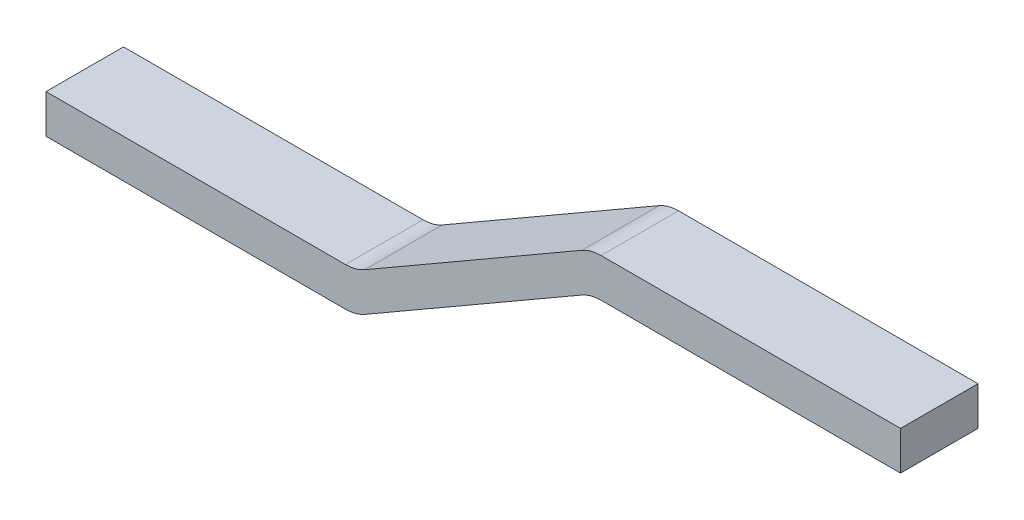
ISO-10303-21;
HEADER;
FILE_DESCRIPTION(('STEP AP214'),'2;1');
FILE_NAME('part.step','',(''),(''),'','','');
FILE_SCHEMA(('AUTOMOTIVE_DESIGN { 1 0 10303 214 1 1 1 1 }'));
ENDSEC;
DATA;
#1=APPLICATION_CONTEXT('core data for automotive mechanical design processes');
#2=APPLICATION_PROTOCOL_DEFINITION('international standard','automotive_design',2000,#1);
#3=PRODUCT_CONTEXT('',#1,'mechanical');
#4=PRODUCT('Part','Part','',(#3));
#5=PRODUCT_RELATED_PRODUCT_CATEGORY('part','',(#4));
#6=PRODUCT_DEFINITION_FORMATION('','',#4);
#7=PRODUCT_DEFINITION_CONTEXT('part definition',#1,'design');
#8=PRODUCT_DEFINITION('design','',#6,#7);
#9=PRODUCT_DEFINITION_SHAPE('','',#8);
#10=(LENGTH_UNIT() NAMED_UNIT(*) SI_UNIT(.MILLI.,.METRE.));
#11=(NAMED_UNIT(*) PLANE_ANGLE_UNIT() SI_UNIT($,.RADIAN.));
#12=(NAMED_UNIT(*) SI_UNIT($,.STERADIAN.) SOLID_ANGLE_UNIT());
#13=UNCERTAINTY_MEASURE_WITH_UNIT(LENGTH_MEASURE(1.E-05),#10,'distance_accuracy_value','');
#14=(GEOMETRIC_REPRESENTATION_CONTEXT(3) GLOBAL_UNCERTAINTY_ASSIGNED_CONTEXT((#13)) GLOBAL_UNIT_ASSIGNED_CONTEXT((#10,
#11,#12)) REPRESENTATION_CONTEXT('',''));
#15=CARTESIAN_POINT('',(0.,0.,0.));
#16=DIRECTION('',(0.,0.,1.));
#17=DIRECTION('',(1.,0.,0.));
#18=AXIS2_PLACEMENT_3D('',#15,#16,#17);
#19=CARTESIAN_POINT('',(20.,0.,10.));
#20=DIRECTION('',(0.,-1.,0.));
#21=DIRECTION('',(1.,0.,0.));
#22=AXIS2_PLACEMENT_3D('',#19,#20,#21);
#23=PLANE('',#22);
#24=DIRECTION('',(-1.,0.,0.));
#25=VECTOR('',#24,1.);
#26=CARTESIAN_POINT('',(20.,0.,0.));
#27=LINE('',#26,#25);
#28=CARTESIAN_POINT('',(18.6602540378444,0.,0.));
#29=VERTEX_POINT('',#28);
#30=CARTESIAN_POINT('',(-20.,0.,0.));
#31=VERTEX_POINT('',#30);
#32=EDGE_CURVE('E157',#29,#31,#27,.T.);
#33=ORIENTED_EDGE('',*,*,#32,.F.);
#34=DIRECTION('',(0.,0.,-1.));
#35=VECTOR('',#34,1.);
#36=CARTESIAN_POINT('',(18.6602540378444,0.,10.));
#37=LINE('',#36,#35);
#38=CARTESIAN_POINT('',(18.6602540378444,0.,10.));
#39=VERTEX_POINT('',#38);
#40=EDGE_CURVE('E54',#29,#39,#37,.F.);
#41=ORIENTED_EDGE('',*,*,#40,.T.);
#42=DIRECTION('',(-1.,0.,0.));
#43=VECTOR('',#42,1.);
#44=CARTESIAN_POINT('',(20.,0.,10.));
#45=LINE('',#44,#43);
#46=CARTESIAN_POINT('',(-20.,0.,10.));
#47=VERTEX_POINT('',#46);
#48=EDGE_CURVE('E121',#39,#47,#45,.T.);
#49=ORIENTED_EDGE('',*,*,#48,.T.);
#50=DIRECTION('',(0.,0.,-1.));
#51=VECTOR('',#50,1.);
#52=CARTESIAN_POINT('',(-20.,0.,10.));
#53=LINE('',#52,#51);
#54=EDGE_CURVE('E123',#47,#31,#53,.T.);
#55=ORIENTED_EDGE('',*,*,#54,.T.);
#56=EDGE_LOOP('',(#33,#41,#49,#55));
#57=FACE_BOUND('',#56,.T.);
#58=ADVANCED_FACE('F33',(#57),#23,.T.);
#59=CARTESIAN_POINT('',(50.3108891324553,17.5,10.));
#60=DIRECTION('',(0.500000000000001,-0.866025403784438,0.));
#61=DIRECTION('',(0.866025403784438,0.500000000000001,0.));
#62=AXIS2_PLACEMENT_3D('',#59,#60,#61);
#63=PLANE('',#62);
#64=DIRECTION('',(-0.866025403784438,-0.500000000000001,0.));
#65=VECTOR('',#64,1.);
#66=CARTESIAN_POINT('',(50.3108891324553,17.5,0.));
#67=LINE('',#66,#65);
#68=CARTESIAN_POINT('',(49.1506350946109,16.8301270189222,0.));
#69=VERTEX_POINT('',#68);
#70=CARTESIAN_POINT('',(21.1602540378444,0.669872981077815,0.));
#71=VERTEX_POINT('',#70);
#72=EDGE_CURVE('E128',#69,#71,#67,.T.);
#73=ORIENTED_EDGE('',*,*,#72,.F.);
#74=DIRECTION('',(0.,0.,-1.));
#75=VECTOR('',#74,1.);
#76=CARTESIAN_POINT('',(49.1506350946109,16.8301270189222,10.));
#77=LINE('',#76,#75);
#78=CARTESIAN_POINT('',(49.1506350946109,16.8301270189222,10.));
#79=VERTEX_POINT('',#78);
#80=EDGE_CURVE('E188',#69,#79,#77,.F.);
#81=ORIENTED_EDGE('',*,*,#80,.T.);
#82=DIRECTION('',(-0.866025403784438,-0.500000000000001,0.));
#83=VECTOR('',#82,1.);
#84=CARTESIAN_POINT('',(50.3108891324553,17.5,10.));
#85=LINE('',#84,#83);
#86=CARTESIAN_POINT('',(21.1602540378444,0.669872981077815,10.));
#87=VERTEX_POINT('',#86);
#88=EDGE_CURVE('E136',#79,#87,#85,.T.);
#89=ORIENTED_EDGE('',*,*,#88,.T.);
#90=DIRECTION('',(0.,0.,-1.));
#91=VECTOR('',#90,1.);
#92=CARTESIAN_POINT('',(21.1602540378444,0.669872981077815,10.));
#93=LINE('',#92,#91);
#94=EDGE_CURVE('E185',#87,#71,#93,.T.);
#95=ORIENTED_EDGE('',*,*,#94,.T.);
#96=EDGE_LOOP('',(#73,#81,#89,#95));
#97=FACE_BOUND('',#96,.T.);
#98=ADVANCED_FACE('F231',(#97),#63,.T.);
#99=CARTESIAN_POINT('',(90.3108891324553,17.5,10.));
#100=DIRECTION('',(0.,-1.,0.));
#101=DIRECTION('',(1.,0.,0.));
#102=AXIS2_PLACEMENT_3D('',#99,#100,#101);
#103=PLANE('',#102);
#104=DIRECTION('',(-1.,0.,0.));
#105=VECTOR('',#104,1.);
#106=CARTESIAN_POINT('',(90.3108891324553,17.5,10.));
#107=LINE('',#106,#105);
#108=CARTESIAN_POINT('',(90.3108891324553,17.5,10.));
#109=VERTEX_POINT('',#108);
#110=CARTESIAN_POINT('',(51.6506350946109,17.5,10.));
#111=VERTEX_POINT('',#110);
#112=EDGE_CURVE('E152',#109,#111,#107,.T.);
#113=ORIENTED_EDGE('',*,*,#112,.T.);
#114=DIRECTION('',(0.,0.,-1.));
#115=VECTOR('',#114,1.);
#116=CARTESIAN_POINT('',(51.6506350946109,17.5,0.));
#117=LINE('',#116,#115);
#118=CARTESIAN_POINT('',(51.6506350946109,17.5,0.));
#119=VERTEX_POINT('',#118);
#120=EDGE_CURVE('E178',#111,#119,#117,.T.);
#121=ORIENTED_EDGE('',*,*,#120,.T.);
#122=DIRECTION('',(-1.,0.,0.));
#123=VECTOR('',#122,1.);
#124=CARTESIAN_POINT('',(90.3108891324553,17.5,0.));
#125=LINE('',#124,#123);
#126=CARTESIAN_POINT('',(90.3108891324553,17.5,0.));
#127=VERTEX_POINT('',#126);
#128=EDGE_CURVE('E171',#127,#119,#125,.T.);
#129=ORIENTED_EDGE('',*,*,#128,.F.);
#130=DIRECTION('',(0.,0.,-1.));
#131=VECTOR('',#130,1.);
#132=CARTESIAN_POINT('',(90.3108891324553,17.5,10.));
#133=LINE('',#132,#131);
#134=EDGE_CURVE('E176',#109,#127,#133,.T.);
#135=ORIENTED_EDGE('',*,*,#134,.F.);
#136=EDGE_LOOP('',(#113,#121,#129,#135));
#137=FACE_BOUND('',#136,.T.);
#138=ADVANCED_FACE('F239',(#137),#103,.T.);
#139=CARTESIAN_POINT('',(90.3108891324553,22.5,10.));
#140=DIRECTION('',(1.,0.,0.));
#141=DIRECTION('',(0.,1.,0.));
#142=AXIS2_PLACEMENT_3D('',#139,#140,#141);
#143=PLANE('',#142);
#144=DIRECTION('',(0.,-1.,0.));
#145=VECTOR('',#144,1.);
#146=CARTESIAN_POINT('',(90.3108891324553,22.5,0.));
#147=LINE('',#146,#145);
#148=CARTESIAN_POINT('',(90.3108891324553,22.5,0.));
#149=VERTEX_POINT('',#148);
#150=EDGE_CURVE('E168',#149,#127,#147,.T.);
#151=ORIENTED_EDGE('',*,*,#150,.F.);
#152=DIRECTION('',(0.,0.,-1.));
#153=VECTOR('',#152,1.);
#154=CARTESIAN_POINT('',(90.3108891324553,22.5,10.));
#155=LINE('',#154,#153);
#156=CARTESIAN_POINT('',(90.3108891324553,22.5,10.));
#157=VERTEX_POINT('',#156);
#158=EDGE_CURVE('E179',#157,#149,#155,.T.);
#159=ORIENTED_EDGE('',*,*,#158,.F.);
#160=DIRECTION('',(0.,-1.,0.));
#161=VECTOR('',#160,1.);
#162=CARTESIAN_POINT('',(90.3108891324553,22.5,10.));
#163=LINE('',#162,#161);
#164=EDGE_CURVE('E149',#157,#109,#163,.T.);
#165=ORIENTED_EDGE('',*,*,#164,.T.);
#166=ORIENTED_EDGE('',*,*,#134,.T.);
#167=EDGE_LOOP('',(#151,#159,#165,#166));
#168=FACE_BOUND('',#167,.T.);
#169=ADVANCED_FACE('F243',(#168),#143,.T.);
#170=CARTESIAN_POINT('',(50.3108891324553,22.5000000000001,10.));
#171=DIRECTION('',(0.,1.,0.));
#172=DIRECTION('',(-1.,0.,0.));
#173=AXIS2_PLACEMENT_3D('',#170,#171,#172);
#174=PLANE('',#173);
#175=DIRECTION('',(1.,0.,0.));
#176=VECTOR('',#175,1.);
#177=CARTESIAN_POINT('',(50.3108891324553,22.5000000000001,0.));
#178=LINE('',#177,#176);
#179=CARTESIAN_POINT('',(51.6506350946109,22.5000000000001,0.));
#180=VERTEX_POINT('',#179);
#181=EDGE_CURVE('E166',#180,#149,#178,.T.);
#182=ORIENTED_EDGE('',*,*,#181,.F.);
#183=DIRECTION('',(0.,0.,-1.));
#184=VECTOR('',#183,1.);
#185=CARTESIAN_POINT('',(51.6506350946109,22.5000000000001,10.));
#186=LINE('',#185,#184);
#187=CARTESIAN_POINT('',(51.6506350946109,22.5000000000001,10.));
#188=VERTEX_POINT('',#187);
#189=EDGE_CURVE('E199',#180,#188,#186,.F.);
#190=ORIENTED_EDGE('',*,*,#189,.T.);
#191=DIRECTION('',(1.,0.,0.));
#192=VECTOR('',#191,1.);
#193=CARTESIAN_POINT('',(50.3108891324553,22.5000000000001,10.));
#194=LINE('',#193,#192);
#195=EDGE_CURVE('E147',#188,#157,#194,.T.);
#196=ORIENTED_EDGE('',*,*,#195,.T.);
#197=ORIENTED_EDGE('',*,*,#158,.T.);
#198=EDGE_LOOP('',(#182,#190,#196,#197));
#199=FACE_BOUND('',#198,.T.);
#200=ADVANCED_FACE('F251',(#199),#174,.T.);
#201=CARTESIAN_POINT('',(20.,5.,10.));
#202=DIRECTION('',(-0.500000000000001,0.866025403784438,0.));
#203=DIRECTION('',(-0.866025403784438,-0.500000000000001,0.));
#204=AXIS2_PLACEMENT_3D('',#201,#202,#203);
#205=PLANE('',#204);
#206=DIRECTION('',(0.866025403784438,0.500000000000001,0.));
#207=VECTOR('',#206,1.);
#208=CARTESIAN_POINT('',(20.,5.,10.));
#209=LINE('',#208,#207);
#210=CARTESIAN_POINT('',(21.1602540378444,5.66987298107781,10.));
#211=VERTEX_POINT('',#210);
#212=CARTESIAN_POINT('',(49.1506350946109,21.8301270189222,10.));
#213=VERTEX_POINT('',#212);
#214=EDGE_CURVE('E142',#211,#213,#209,.T.);
#215=ORIENTED_EDGE('',*,*,#214,.T.);
#216=DIRECTION('',(0.,0.,-1.));
#217=VECTOR('',#216,1.);
#218=CARTESIAN_POINT('',(49.1506350946109,21.8301270189222,10.));
#219=LINE('',#218,#217);
#220=CARTESIAN_POINT('',(49.1506350946109,21.8301270189222,0.));
#221=VERTEX_POINT('',#220);
#222=EDGE_CURVE('E192',#213,#221,#219,.T.);
#223=ORIENTED_EDGE('',*,*,#222,.T.);
#224=DIRECTION('',(0.866025403784438,0.500000000000001,0.));
#225=VECTOR('',#224,1.);
#226=CARTESIAN_POINT('',(20.,5.,0.));
#227=LINE('',#226,#225);
#228=CARTESIAN_POINT('',(21.1602540378444,5.66987298107781,0.));
#229=VERTEX_POINT('',#228);
#230=EDGE_CURVE('E163',#229,#221,#227,.T.);
#231=ORIENTED_EDGE('',*,*,#230,.F.);
#232=DIRECTION('',(0.,0.,-1.));
#233=VECTOR('',#232,1.);
#234=CARTESIAN_POINT('',(21.1602540378444,5.66987298107781,10.));
#235=LINE('',#234,#233);
#236=EDGE_CURVE('E190',#229,#211,#235,.F.);
#237=ORIENTED_EDGE('',*,*,#236,.T.);
#238=EDGE_LOOP('',(#215,#223,#231,#237));
#239=FACE_BOUND('',#238,.T.);
#240=ADVANCED_FACE('F220',(#239),#205,.T.);
#241=CARTESIAN_POINT('',(-20.,5.,10.));
#242=DIRECTION('',(0.,1.,0.));
#243=DIRECTION('',(-1.,0.,0.));
#244=AXIS2_PLACEMENT_3D('',#241,#242,#243);
#245=PLANE('',#244);
#246=DIRECTION('',(1.,0.,0.));
#247=VECTOR('',#246,1.);
#248=CARTESIAN_POINT('',(-20.,5.,10.));
#249=LINE('',#248,#247);
#250=CARTESIAN_POINT('',(-20.,5.,10.));
#251=VERTEX_POINT('',#250);
#252=CARTESIAN_POINT('',(18.6602540378444,5.,10.));
#253=VERTEX_POINT('',#252);
#254=EDGE_CURVE('E140',#251,#253,#249,.T.);
#255=ORIENTED_EDGE('',*,*,#254,.T.);
#256=DIRECTION('',(0.,0.,-1.));
#257=VECTOR('',#256,1.);
#258=CARTESIAN_POINT('',(18.6602540378444,5.,0.));
#259=LINE('',#258,#257);
#260=CARTESIAN_POINT('',(18.6602540378444,5.,0.));
#261=VERTEX_POINT('',#260);
#262=EDGE_CURVE('E206',#253,#261,#259,.T.);
#263=ORIENTED_EDGE('',*,*,#262,.T.);
#264=DIRECTION('',(1.,0.,0.));
#265=VECTOR('',#264,1.);
#266=CARTESIAN_POINT('',(-20.,5.,0.));
#267=LINE('',#266,#265);
#268=CARTESIAN_POINT('',(-20.,5.,0.));
#269=VERTEX_POINT('',#268);
#270=EDGE_CURVE('E160',#269,#261,#267,.T.);
#271=ORIENTED_EDGE('',*,*,#270,.F.);
#272=DIRECTION('',(0.,0.,-1.));
#273=VECTOR('',#272,1.);
#274=CARTESIAN_POINT('',(-20.,5.,10.));
#275=LINE('',#274,#273);
#276=EDGE_CURVE('E135',#251,#269,#275,.T.);
#277=ORIENTED_EDGE('',*,*,#276,.F.);
#278=EDGE_LOOP('',(#255,#263,#271,#277));
#279=FACE_BOUND('',#278,.T.);
#280=ADVANCED_FACE('F223',(#279),#245,.T.);
#281=CARTESIAN_POINT('',(-20.,0.,10.));
#282=DIRECTION('',(-1.,0.,0.));
#283=DIRECTION('',(0.,0.,1.));
#284=AXIS2_PLACEMENT_3D('',#281,#282,#283);
#285=PLANE('',#284);
#286=DIRECTION('',(0.,1.,0.));
#287=VECTOR('',#286,1.);
#288=CARTESIAN_POINT('',(-20.,0.,0.));
#289=LINE('',#288,#287);
#290=EDGE_CURVE('E134',#31,#269,#289,.T.);
#291=ORIENTED_EDGE('',*,*,#290,.F.);
#292=ORIENTED_EDGE('',*,*,#54,.F.);
#293=DIRECTION('',(0.,1.,0.));
#294=VECTOR('',#293,1.);
#295=CARTESIAN_POINT('',(-20.,0.,10.));
#296=LINE('',#295,#294);
#297=EDGE_CURVE('E127',#47,#251,#296,.T.);
#298=ORIENTED_EDGE('',*,*,#297,.T.);
#299=ORIENTED_EDGE('',*,*,#276,.T.);
#300=EDGE_LOOP('',(#291,#292,#298,#299));
#301=FACE_BOUND('',#300,.T.);
#302=ADVANCED_FACE('F132',(#301),#285,.T.);
#303=CARTESIAN_POINT('',(0.,0.,10.));
#304=DIRECTION('',(0.,0.,-1.));
#305=DIRECTION('',(-1.,0.,0.));
#306=AXIS2_PLACEMENT_3D('',#303,#304,#305);
#307=PLANE('',#306);
#308=ORIENTED_EDGE('',*,*,#195,.F.);
#309=CARTESIAN_POINT('',(51.6506350946109,17.5000000000001,10.));
#310=DIRECTION('',(0.,0.,-1.));
#311=DIRECTION('',(-1.,0.,0.));
#312=AXIS2_PLACEMENT_3D('',#309,#310,#311);
#313=CIRCLE('',#312,5.);
#314=EDGE_CURVE('E203',#188,#213,#313,.F.);
#315=ORIENTED_EDGE('',*,*,#314,.T.);
#316=ORIENTED_EDGE('',*,*,#214,.F.);
#317=CARTESIAN_POINT('',(18.6602540378444,9.99999999999999,10.));
#318=DIRECTION('',(0.,0.,-1.));
#319=DIRECTION('',(-1.,0.,0.));
#320=AXIS2_PLACEMENT_3D('',#317,#318,#319);
#321=CIRCLE('',#320,5.);
#322=EDGE_CURVE('E11',#211,#253,#321,.T.);
#323=ORIENTED_EDGE('',*,*,#322,.T.);
#324=ORIENTED_EDGE('',*,*,#254,.F.);
#325=ORIENTED_EDGE('',*,*,#297,.F.);
#326=ORIENTED_EDGE('',*,*,#48,.F.);
#327=CARTESIAN_POINT('',(18.6602540378444,5.00000000000001,10.));
#328=DIRECTION('',(0.,0.,-1.));
#329=DIRECTION('',(-1.,0.,0.));
#330=AXIS2_PLACEMENT_3D('',#327,#328,#329);
#331=CIRCLE('',#330,5.);
#332=EDGE_CURVE('E201',#39,#87,#331,.F.);
#333=ORIENTED_EDGE('',*,*,#332,.T.);
#334=ORIENTED_EDGE('',*,*,#88,.F.);
#335=CARTESIAN_POINT('',(51.6506350946109,12.5,10.));
#336=DIRECTION('',(0.,0.,-1.));
#337=DIRECTION('',(-1.,0.,0.));
#338=AXIS2_PLACEMENT_3D('',#335,#336,#337);
#339=CIRCLE('',#338,5.);
#340=EDGE_CURVE('E211',#79,#111,#339,.T.);
#341=ORIENTED_EDGE('',*,*,#340,.T.);
#342=ORIENTED_EDGE('',*,*,#112,.F.);
#343=ORIENTED_EDGE('',*,*,#164,.F.);
#344=EDGE_LOOP('',(#308,#315,#316,#323,#324,#325,#326,#333,#334,#341,#342,#343));
#345=FACE_BOUND('',#344,.T.);
#346=ADVANCED_FACE('F139',(#345),#307,.F.);
#347=CARTESIAN_POINT('',(0.,0.,0.));
#348=DIRECTION('',(0.,0.,-1.));
#349=DIRECTION('',(-1.,0.,0.));
#350=AXIS2_PLACEMENT_3D('',#347,#348,#349);
#351=PLANE('',#350);
#352=ORIENTED_EDGE('',*,*,#230,.T.);
#353=CARTESIAN_POINT('',(51.6506350946109,17.5000000000001,0.));
#354=DIRECTION('',(0.,0.,-1.));
#355=DIRECTION('',(-1.,0.,0.));
#356=AXIS2_PLACEMENT_3D('',#353,#354,#355);
#357=CIRCLE('',#356,5.);
#358=EDGE_CURVE('E197',#221,#180,#357,.T.);
#359=ORIENTED_EDGE('',*,*,#358,.T.);
#360=ORIENTED_EDGE('',*,*,#181,.T.);
#361=ORIENTED_EDGE('',*,*,#150,.T.);
#362=ORIENTED_EDGE('',*,*,#128,.T.);
#363=CARTESIAN_POINT('',(51.6506350946109,12.5,0.));
#364=DIRECTION('',(0.,0.,-1.));
#365=DIRECTION('',(-1.,0.,0.));
#366=AXIS2_PLACEMENT_3D('',#363,#364,#365);
#367=CIRCLE('',#366,5.);
#368=EDGE_CURVE('E209',#119,#69,#367,.F.);
#369=ORIENTED_EDGE('',*,*,#368,.T.);
#370=ORIENTED_EDGE('',*,*,#72,.T.);
#371=CARTESIAN_POINT('',(18.6602540378444,5.00000000000001,0.));
#372=DIRECTION('',(0.,0.,-1.));
#373=DIRECTION('',(-1.,0.,0.));
#374=AXIS2_PLACEMENT_3D('',#371,#372,#373);
#375=CIRCLE('',#374,5.);
#376=EDGE_CURVE('E195',#71,#29,#375,.T.);
#377=ORIENTED_EDGE('',*,*,#376,.T.);
#378=ORIENTED_EDGE('',*,*,#32,.T.);
#379=ORIENTED_EDGE('',*,*,#290,.T.);
#380=ORIENTED_EDGE('',*,*,#270,.T.);
#381=CARTESIAN_POINT('',(18.6602540378444,9.99999999999999,0.));
#382=DIRECTION('',(0.,0.,-1.));
#383=DIRECTION('',(-1.,0.,0.));
#384=AXIS2_PLACEMENT_3D('',#381,#382,#383);
#385=CIRCLE('',#384,5.);
#386=EDGE_CURVE('E41',#261,#229,#385,.F.);
#387=ORIENTED_EDGE('',*,*,#386,.T.);
#388=EDGE_LOOP('',(#352,#359,#360,#361,#362,#369,#370,#377,#378,#379,#380,#387));
#389=FACE_BOUND('',#388,.T.);
#390=ADVANCED_FACE('F214',(#389),#351,.T.);
#391=CARTESIAN_POINT('',(51.6506350946109,12.5,10.));
#392=DIRECTION('',(0.,0.,1.));
#393=DIRECTION('',(1.,0.,0.));
#394=AXIS2_PLACEMENT_3D('',#391,#392,#393);
#395=CYLINDRICAL_SURFACE('',#394,5.);
#396=ORIENTED_EDGE('',*,*,#340,.F.);
#397=ORIENTED_EDGE('',*,*,#80,.F.);
#398=ORIENTED_EDGE('',*,*,#368,.F.);
#399=ORIENTED_EDGE('',*,*,#120,.F.);
#400=EDGE_LOOP('',(#396,#397,#398,#399));
#401=FACE_BOUND('',#400,.T.);
#402=ADVANCED_FACE('F234',(#401),#395,.F.);
#403=CARTESIAN_POINT('',(51.6506350946109,17.5000000000001,10.));
#404=DIRECTION('',(0.,0.,-1.));
#405=DIRECTION('',(-1.,0.,0.));
#406=AXIS2_PLACEMENT_3D('',#403,#404,#405);
#407=CYLINDRICAL_SURFACE('',#406,5.);
#408=ORIENTED_EDGE('',*,*,#314,.F.);
#409=ORIENTED_EDGE('',*,*,#189,.F.);
#410=ORIENTED_EDGE('',*,*,#358,.F.);
#411=ORIENTED_EDGE('',*,*,#222,.F.);
#412=EDGE_LOOP('',(#408,#409,#410,#411));
#413=FACE_BOUND('',#412,.T.);
#414=ADVANCED_FACE('F249',(#413),#407,.T.);
#415=CARTESIAN_POINT('',(18.6602540378444,5.00000000000001,10.));
#416=DIRECTION('',(0.,0.,-1.));
#417=DIRECTION('',(-1.,0.,0.));
#418=AXIS2_PLACEMENT_3D('',#415,#416,#417);
#419=CYLINDRICAL_SURFACE('',#418,5.);
#420=ORIENTED_EDGE('',*,*,#332,.F.);
#421=ORIENTED_EDGE('',*,*,#40,.F.);
#422=ORIENTED_EDGE('',*,*,#376,.F.);
#423=ORIENTED_EDGE('',*,*,#94,.F.);
#424=EDGE_LOOP('',(#420,#421,#422,#423));
#425=FACE_BOUND('',#424,.T.);
#426=ADVANCED_FACE('F225',(#425),#419,.T.);
#427=CARTESIAN_POINT('',(18.6602540378444,9.99999999999999,10.));
#428=DIRECTION('',(0.,0.,1.));
#429=DIRECTION('',(1.,0.,0.));
#430=AXIS2_PLACEMENT_3D('',#427,#428,#429);
#431=CYLINDRICAL_SURFACE('',#430,5.);
#432=ORIENTED_EDGE('',*,*,#322,.F.);
#433=ORIENTED_EDGE('',*,*,#236,.F.);
#434=ORIENTED_EDGE('',*,*,#386,.F.);
#435=ORIENTED_EDGE('',*,*,#262,.F.);
#436=EDGE_LOOP('',(#432,#433,#434,#435));
#437=FACE_BOUND('',#436,.T.);
#438=ADVANCED_FACE('F35',(#437),#431,.F.);
#439=CLOSED_SHELL('',(#58,#98,#138,#169,#200,#240,#280,#302,#346,#390,#402,#414,#426,#438));
#440=MANIFOLD_SOLID_BREP('B2',#439);
#441=ADVANCED_BREP_SHAPE_REPRESENTATION('',(#18,#440),#14);
#442=SHAPE_DEFINITION_REPRESENTATION(#9,#441);
ENDSEC;
END-ISO-10303-21;
